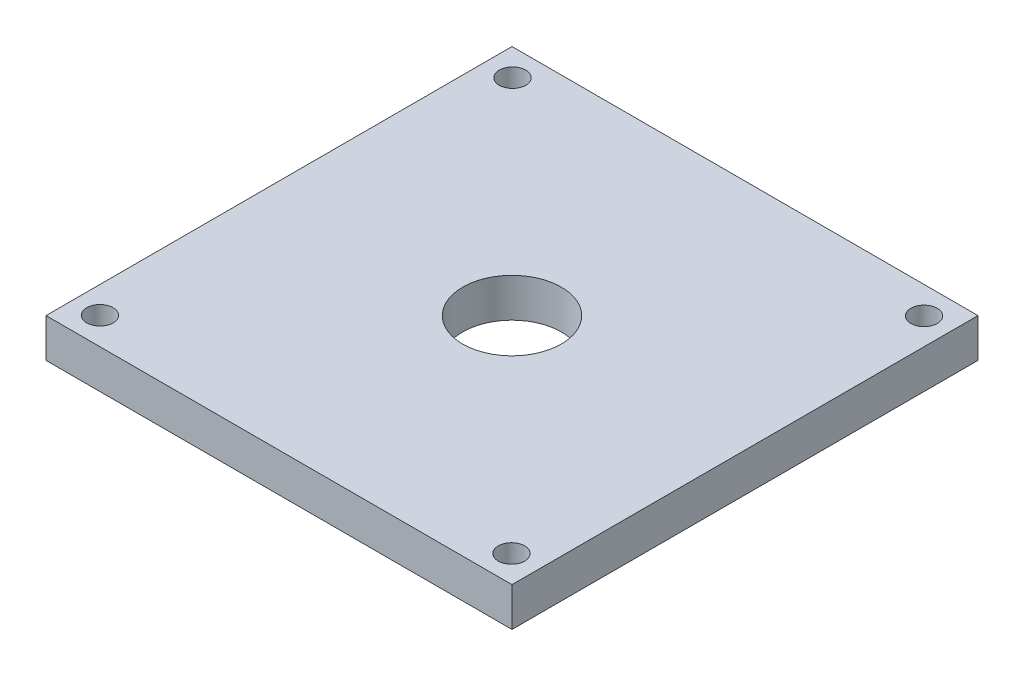
ISO-10303-21;
HEADER;
FILE_DESCRIPTION(('STEP AP214'),'2;1');
FILE_NAME('part.step','',(''),(''),'','','');
FILE_SCHEMA(('AUTOMOTIVE_DESIGN { 1 0 10303 214 1 1 1 1 }'));
ENDSEC;
DATA;
#1=APPLICATION_CONTEXT('core data for automotive mechanical design processes');
#2=APPLICATION_PROTOCOL_DEFINITION('international standard','automotive_design',2000,#1);
#3=PRODUCT_CONTEXT('',#1,'mechanical');
#4=PRODUCT('Part','Part','',(#3));
#5=PRODUCT_RELATED_PRODUCT_CATEGORY('part','',(#4));
#6=PRODUCT_DEFINITION_FORMATION('','',#4);
#7=PRODUCT_DEFINITION_CONTEXT('part definition',#1,'design');
#8=PRODUCT_DEFINITION('design','',#6,#7);
#9=PRODUCT_DEFINITION_SHAPE('','',#8);
#10=(LENGTH_UNIT() NAMED_UNIT(*) SI_UNIT(.MILLI.,.METRE.));
#11=(NAMED_UNIT(*) PLANE_ANGLE_UNIT() SI_UNIT($,.RADIAN.));
#12=(NAMED_UNIT(*) SI_UNIT($,.STERADIAN.) SOLID_ANGLE_UNIT());
#13=UNCERTAINTY_MEASURE_WITH_UNIT(LENGTH_MEASURE(1.E-05),#10,'distance_accuracy_value','');
#14=(GEOMETRIC_REPRESENTATION_CONTEXT(3) GLOBAL_UNCERTAINTY_ASSIGNED_CONTEXT((#13)) GLOBAL_UNIT_ASSIGNED_CONTEXT((#10,
#11,#12)) REPRESENTATION_CONTEXT('',''));
#15=CARTESIAN_POINT('',(0.,0.,0.));
#16=DIRECTION('',(0.,0.,1.));
#17=DIRECTION('',(1.,0.,0.));
#18=AXIS2_PLACEMENT_3D('',#15,#16,#17);
#19=CARTESIAN_POINT('',(0.,5.,0.));
#20=DIRECTION('',(0.,-1.,0.));
#21=DIRECTION('',(0.,0.,-1.));
#22=AXIS2_PLACEMENT_3D('',#19,#20,#21);
#23=PLANE('',#22);
#24=DIRECTION('',(0.,0.,1.));
#25=VECTOR('',#24,1.);
#26=CARTESIAN_POINT('',(0.,5.,0.));
#27=LINE('',#26,#25);
#28=CARTESIAN_POINT('',(0.,5.,-60.));
#29=VERTEX_POINT('',#28);
#30=CARTESIAN_POINT('',(0.,5.,0.));
#31=VERTEX_POINT('',#30);
#32=EDGE_CURVE('E95',#29,#31,#27,.T.);
#33=ORIENTED_EDGE('',*,*,#32,.T.);
#34=DIRECTION('',(1.,0.,0.));
#35=VECTOR('',#34,1.);
#36=CARTESIAN_POINT('',(0.,5.,0.));
#37=LINE('',#36,#35);
#38=CARTESIAN_POINT('',(60.,5.,0.));
#39=VERTEX_POINT('',#38);
#40=EDGE_CURVE('E90',#31,#39,#37,.T.);
#41=ORIENTED_EDGE('',*,*,#40,.T.);
#42=DIRECTION('',(0.,0.,-1.));
#43=VECTOR('',#42,1.);
#44=CARTESIAN_POINT('',(60.,5.,0.));
#45=LINE('',#44,#43);
#46=CARTESIAN_POINT('',(60.,5.,-60.));
#47=VERTEX_POINT('',#46);
#48=EDGE_CURVE('E93',#39,#47,#45,.T.);
#49=ORIENTED_EDGE('',*,*,#48,.T.);
#50=DIRECTION('',(-1.,0.,0.));
#51=VECTOR('',#50,1.);
#52=CARTESIAN_POINT('',(0.,5.,-60.));
#53=LINE('',#52,#51);
#54=EDGE_CURVE('E60',#47,#29,#53,.T.);
#55=ORIENTED_EDGE('',*,*,#54,.T.);
#56=EDGE_LOOP('',(#33,#41,#49,#55));
#57=FACE_BOUND('',#56,.T.);
#58=CARTESIAN_POINT('',(30.,5.,-30.));
#59=DIRECTION('',(0.,1.,0.));
#60=DIRECTION('',(0.,0.,1.));
#61=AXIS2_PLACEMENT_3D('',#58,#59,#60);
#62=CIRCLE('',#61,6.35);
#63=CARTESIAN_POINT('',(30.,5.,-23.65));
#64=VERTEX_POINT('',#63);
#65=EDGE_CURVE('E110',#64,#64,#62,.T.);
#66=ORIENTED_EDGE('',*,*,#65,.F.);
#67=EDGE_LOOP('',(#66));
#68=FACE_BOUND('',#67,.T.);
#69=CARTESIAN_POINT('',(3.50530286820927,5.,-56.5602431527652));
#70=DIRECTION('',(0.,1.,0.));
#71=DIRECTION('',(0.,0.,1.));
#72=AXIS2_PLACEMENT_3D('',#69,#70,#71);
#73=CIRCLE('',#72,1.7);
#74=CARTESIAN_POINT('',(3.50530286820927,5.,-54.8602431527652));
#75=VERTEX_POINT('',#74);
#76=EDGE_CURVE('E125',#75,#75,#73,.T.);
#77=ORIENTED_EDGE('',*,*,#76,.F.);
#78=EDGE_LOOP('',(#77));
#79=FACE_BOUND('',#78,.T.);
#80=CARTESIAN_POINT('',(56.5602431527653,5.,-56.4946971317914));
#81=DIRECTION('',(0.,1.,0.));
#82=DIRECTION('',(0.,0.,1.));
#83=AXIS2_PLACEMENT_3D('',#80,#81,#82);
#84=CIRCLE('',#83,1.7);
#85=CARTESIAN_POINT('',(56.5602431527653,5.,-54.7946971317914));
#86=VERTEX_POINT('',#85);
#87=EDGE_CURVE('E131',#86,#86,#84,.T.);
#88=ORIENTED_EDGE('',*,*,#87,.F.);
#89=EDGE_LOOP('',(#88));
#90=FACE_BOUND('',#89,.T.);
#91=CARTESIAN_POINT('',(56.4946971317913,5.,-3.43975684723538));
#92=DIRECTION('',(0.,1.,0.));
#93=DIRECTION('',(0.,0.,1.));
#94=AXIS2_PLACEMENT_3D('',#91,#92,#93);
#95=CIRCLE('',#94,1.7);
#96=CARTESIAN_POINT('',(56.4946971317913,5.,-1.73975684723538));
#97=VERTEX_POINT('',#96);
#98=EDGE_CURVE('E137',#97,#97,#95,.T.);
#99=ORIENTED_EDGE('',*,*,#98,.F.);
#100=EDGE_LOOP('',(#99));
#101=FACE_BOUND('',#100,.T.);
#102=CARTESIAN_POINT('',(3.43975684723528,5.,-3.50530286820955));
#103=DIRECTION('',(0.,1.,0.));
#104=DIRECTION('',(0.,0.,1.));
#105=AXIS2_PLACEMENT_3D('',#102,#103,#104);
#106=CIRCLE('',#105,1.7);
#107=CARTESIAN_POINT('',(3.43975684723528,5.,-1.80530286820955));
#108=VERTEX_POINT('',#107);
#109=EDGE_CURVE('E143',#108,#108,#106,.T.);
#110=ORIENTED_EDGE('',*,*,#109,.F.);
#111=EDGE_LOOP('',(#110));
#112=FACE_BOUND('',#111,.T.);
#113=ADVANCED_FACE('F43',(#57,#68,#79,#90,#101,#112),#23,.F.);
#114=CARTESIAN_POINT('',(0.,0.,0.));
#115=DIRECTION('',(0.,-1.,0.));
#116=DIRECTION('',(0.,0.,-1.));
#117=AXIS2_PLACEMENT_3D('',#114,#115,#116);
#118=PLANE('',#117);
#119=CARTESIAN_POINT('',(56.4946971317913,0.,-3.43975684723538));
#120=DIRECTION('',(0.,1.,0.));
#121=DIRECTION('',(0.,0.,1.));
#122=AXIS2_PLACEMENT_3D('',#119,#120,#121);
#123=CIRCLE('',#122,1.7);
#124=CARTESIAN_POINT('',(56.4946971317913,0.,-1.73975684723538));
#125=VERTEX_POINT('',#124);
#126=EDGE_CURVE('E140',#125,#125,#123,.T.);
#127=ORIENTED_EDGE('',*,*,#126,.T.);
#128=EDGE_LOOP('',(#127));
#129=FACE_BOUND('',#128,.T.);
#130=CARTESIAN_POINT('',(3.50530286820927,0.,-56.5602431527652));
#131=DIRECTION('',(0.,1.,0.));
#132=DIRECTION('',(0.,0.,1.));
#133=AXIS2_PLACEMENT_3D('',#130,#131,#132);
#134=CIRCLE('',#133,1.7);
#135=CARTESIAN_POINT('',(3.50530286820927,0.,-54.8602431527652));
#136=VERTEX_POINT('',#135);
#137=EDGE_CURVE('E128',#136,#136,#134,.T.);
#138=ORIENTED_EDGE('',*,*,#137,.T.);
#139=EDGE_LOOP('',(#138));
#140=FACE_BOUND('',#139,.T.);
#141=DIRECTION('',(0.,0.,1.));
#142=VECTOR('',#141,1.);
#143=CARTESIAN_POINT('',(0.,0.,0.));
#144=LINE('',#143,#142);
#145=CARTESIAN_POINT('',(0.,0.,-60.));
#146=VERTEX_POINT('',#145);
#147=CARTESIAN_POINT('',(0.,0.,0.));
#148=VERTEX_POINT('',#147);
#149=EDGE_CURVE('E107',#146,#148,#144,.T.);
#150=ORIENTED_EDGE('',*,*,#149,.F.);
#151=DIRECTION('',(-1.,0.,0.));
#152=VECTOR('',#151,1.);
#153=CARTESIAN_POINT('',(0.,0.,-60.));
#154=LINE('',#153,#152);
#155=CARTESIAN_POINT('',(60.,0.,-60.));
#156=VERTEX_POINT('',#155);
#157=EDGE_CURVE('E83',#156,#146,#154,.T.);
#158=ORIENTED_EDGE('',*,*,#157,.F.);
#159=DIRECTION('',(0.,0.,-1.));
#160=VECTOR('',#159,1.);
#161=CARTESIAN_POINT('',(60.,0.,0.));
#162=LINE('',#161,#160);
#163=CARTESIAN_POINT('',(60.,0.,0.));
#164=VERTEX_POINT('',#163);
#165=EDGE_CURVE('E77',#164,#156,#162,.T.);
#166=ORIENTED_EDGE('',*,*,#165,.F.);
#167=DIRECTION('',(1.,0.,0.));
#168=VECTOR('',#167,1.);
#169=CARTESIAN_POINT('',(0.,0.,0.));
#170=LINE('',#169,#168);
#171=EDGE_CURVE('E99',#148,#164,#170,.T.);
#172=ORIENTED_EDGE('',*,*,#171,.F.);
#173=EDGE_LOOP('',(#150,#158,#166,#172));
#174=FACE_BOUND('',#173,.T.);
#175=CARTESIAN_POINT('',(30.,0.,-30.));
#176=DIRECTION('',(0.,1.,0.));
#177=DIRECTION('',(0.,0.,1.));
#178=AXIS2_PLACEMENT_3D('',#175,#176,#177);
#179=CIRCLE('',#178,6.35);
#180=CARTESIAN_POINT('',(30.,0.,-23.65));
#181=VERTEX_POINT('',#180);
#182=EDGE_CURVE('E122',#181,#181,#179,.T.);
#183=ORIENTED_EDGE('',*,*,#182,.T.);
#184=EDGE_LOOP('',(#183));
#185=FACE_BOUND('',#184,.T.);
#186=CARTESIAN_POINT('',(56.5602431527653,0.,-56.4946971317914));
#187=DIRECTION('',(0.,1.,0.));
#188=DIRECTION('',(0.,0.,1.));
#189=AXIS2_PLACEMENT_3D('',#186,#187,#188);
#190=CIRCLE('',#189,1.7);
#191=CARTESIAN_POINT('',(56.5602431527653,0.,-54.7946971317914));
#192=VERTEX_POINT('',#191);
#193=EDGE_CURVE('E134',#192,#192,#190,.T.);
#194=ORIENTED_EDGE('',*,*,#193,.T.);
#195=EDGE_LOOP('',(#194));
#196=FACE_BOUND('',#195,.T.);
#197=CARTESIAN_POINT('',(3.43975684723528,0.,-3.50530286820955));
#198=DIRECTION('',(0.,1.,0.));
#199=DIRECTION('',(0.,0.,1.));
#200=AXIS2_PLACEMENT_3D('',#197,#198,#199);
#201=CIRCLE('',#200,1.7);
#202=CARTESIAN_POINT('',(3.43975684723528,0.,-1.80530286820955));
#203=VERTEX_POINT('',#202);
#204=EDGE_CURVE('E146',#203,#203,#201,.T.);
#205=ORIENTED_EDGE('',*,*,#204,.T.);
#206=EDGE_LOOP('',(#205));
#207=FACE_BOUND('',#206,.T.);
#208=ADVANCED_FACE('F118',(#129,#140,#174,#185,#196,#207),#118,.T.);
#209=CARTESIAN_POINT('',(0.,5.,0.));
#210=DIRECTION('',(1.,0.,0.));
#211=DIRECTION('',(0.,0.,-1.));
#212=AXIS2_PLACEMENT_3D('',#209,#210,#211);
#213=PLANE('',#212);
#214=ORIENTED_EDGE('',*,*,#149,.T.);
#215=DIRECTION('',(0.,-1.,0.));
#216=VECTOR('',#215,1.);
#217=CARTESIAN_POINT('',(0.,5.,0.));
#218=LINE('',#217,#216);
#219=EDGE_CURVE('E11',#31,#148,#218,.T.);
#220=ORIENTED_EDGE('',*,*,#219,.F.);
#221=ORIENTED_EDGE('',*,*,#32,.F.);
#222=DIRECTION('',(0.,-1.,0.));
#223=VECTOR('',#222,1.);
#224=CARTESIAN_POINT('',(0.,5.,-60.));
#225=LINE('',#224,#223);
#226=EDGE_CURVE('E103',#29,#146,#225,.T.);
#227=ORIENTED_EDGE('',*,*,#226,.T.);
#228=EDGE_LOOP('',(#214,#220,#221,#227));
#229=FACE_BOUND('',#228,.T.);
#230=ADVANCED_FACE('F45',(#229),#213,.F.);
#231=CARTESIAN_POINT('',(0.,5.,0.));
#232=DIRECTION('',(0.,0.,-1.));
#233=DIRECTION('',(-1.,0.,0.));
#234=AXIS2_PLACEMENT_3D('',#231,#232,#233);
#235=PLANE('',#234);
#236=ORIENTED_EDGE('',*,*,#171,.T.);
#237=DIRECTION('',(0.,-1.,0.));
#238=VECTOR('',#237,1.);
#239=CARTESIAN_POINT('',(60.,5.,0.));
#240=LINE('',#239,#238);
#241=EDGE_CURVE('E52',#39,#164,#240,.T.);
#242=ORIENTED_EDGE('',*,*,#241,.F.);
#243=ORIENTED_EDGE('',*,*,#40,.F.);
#244=ORIENTED_EDGE('',*,*,#219,.T.);
#245=EDGE_LOOP('',(#236,#242,#243,#244));
#246=FACE_BOUND('',#245,.T.);
#247=ADVANCED_FACE('F98',(#246),#235,.F.);
#248=CARTESIAN_POINT('',(60.,5.,0.));
#249=DIRECTION('',(-1.,0.,0.));
#250=DIRECTION('',(0.,0.,1.));
#251=AXIS2_PLACEMENT_3D('',#248,#249,#250);
#252=PLANE('',#251);
#253=ORIENTED_EDGE('',*,*,#165,.T.);
#254=DIRECTION('',(0.,-1.,0.));
#255=VECTOR('',#254,1.);
#256=CARTESIAN_POINT('',(60.,5.,-60.));
#257=LINE('',#256,#255);
#258=EDGE_CURVE('E100',#47,#156,#257,.T.);
#259=ORIENTED_EDGE('',*,*,#258,.F.);
#260=ORIENTED_EDGE('',*,*,#48,.F.);
#261=ORIENTED_EDGE('',*,*,#241,.T.);
#262=EDGE_LOOP('',(#253,#259,#260,#261));
#263=FACE_BOUND('',#262,.T.);
#264=ADVANCED_FACE('F101',(#263),#252,.F.);
#265=CARTESIAN_POINT('',(0.,5.,-60.));
#266=DIRECTION('',(0.,0.,1.));
#267=DIRECTION('',(1.,0.,0.));
#268=AXIS2_PLACEMENT_3D('',#265,#266,#267);
#269=PLANE('',#268);
#270=ORIENTED_EDGE('',*,*,#157,.T.);
#271=ORIENTED_EDGE('',*,*,#226,.F.);
#272=ORIENTED_EDGE('',*,*,#54,.F.);
#273=ORIENTED_EDGE('',*,*,#258,.T.);
#274=EDGE_LOOP('',(#270,#271,#272,#273));
#275=FACE_BOUND('',#274,.T.);
#276=ADVANCED_FACE('F115',(#275),#269,.F.);
#277=CARTESIAN_POINT('',(30.,5.,-30.));
#278=DIRECTION('',(0.,-1.,0.));
#279=DIRECTION('',(0.,0.,-1.));
#280=AXIS2_PLACEMENT_3D('',#277,#278,#279);
#281=CYLINDRICAL_SURFACE('',#280,6.35);
#282=ORIENTED_EDGE('',*,*,#65,.T.);
#283=EDGE_LOOP('',(#282));
#284=FACE_BOUND('',#283,.T.);
#285=ORIENTED_EDGE('',*,*,#182,.F.);
#286=EDGE_LOOP('',(#285));
#287=FACE_BOUND('',#286,.T.);
#288=ADVANCED_FACE('F162',(#284,#287),#281,.F.);
#289=CARTESIAN_POINT('',(3.50530286820927,5.,-56.5602431527652));
#290=DIRECTION('',(0.,-1.,0.));
#291=DIRECTION('',(0.,0.,-1.));
#292=AXIS2_PLACEMENT_3D('',#289,#290,#291);
#293=CYLINDRICAL_SURFACE('',#292,1.7);
#294=ORIENTED_EDGE('',*,*,#76,.T.);
#295=EDGE_LOOP('',(#294));
#296=FACE_BOUND('',#295,.T.);
#297=ORIENTED_EDGE('',*,*,#137,.F.);
#298=EDGE_LOOP('',(#297));
#299=FACE_BOUND('',#298,.T.);
#300=ADVANCED_FACE('F213',(#296,#299),#293,.F.);
#301=CARTESIAN_POINT('',(56.5602431527653,5.,-56.4946971317914));
#302=DIRECTION('',(0.,-1.,0.));
#303=DIRECTION('',(0.,0.,-1.));
#304=AXIS2_PLACEMENT_3D('',#301,#302,#303);
#305=CYLINDRICAL_SURFACE('',#304,1.7);
#306=ORIENTED_EDGE('',*,*,#87,.T.);
#307=EDGE_LOOP('',(#306));
#308=FACE_BOUND('',#307,.T.);
#309=ORIENTED_EDGE('',*,*,#193,.F.);
#310=EDGE_LOOP('',(#309));
#311=FACE_BOUND('',#310,.T.);
#312=ADVANCED_FACE('F222',(#308,#311),#305,.F.);
#313=CARTESIAN_POINT('',(56.4946971317913,5.,-3.43975684723538));
#314=DIRECTION('',(0.,-1.,0.));
#315=DIRECTION('',(0.,0.,-1.));
#316=AXIS2_PLACEMENT_3D('',#313,#314,#315);
#317=CYLINDRICAL_SURFACE('',#316,1.7);
#318=ORIENTED_EDGE('',*,*,#98,.T.);
#319=EDGE_LOOP('',(#318));
#320=FACE_BOUND('',#319,.T.);
#321=ORIENTED_EDGE('',*,*,#126,.F.);
#322=EDGE_LOOP('',(#321));
#323=FACE_BOUND('',#322,.T.);
#324=ADVANCED_FACE('F231',(#320,#323),#317,.F.);
#325=CARTESIAN_POINT('',(3.43975684723528,5.,-3.50530286820955));
#326=DIRECTION('',(0.,-1.,0.));
#327=DIRECTION('',(0.,0.,-1.));
#328=AXIS2_PLACEMENT_3D('',#325,#326,#327);
#329=CYLINDRICAL_SURFACE('',#328,1.7);
#330=ORIENTED_EDGE('',*,*,#109,.T.);
#331=EDGE_LOOP('',(#330));
#332=FACE_BOUND('',#331,.T.);
#333=ORIENTED_EDGE('',*,*,#204,.F.);
#334=EDGE_LOOP('',(#333));
#335=FACE_BOUND('',#334,.T.);
#336=ADVANCED_FACE('F152',(#332,#335),#329,.F.);
#337=CLOSED_SHELL('',(#113,#208,#230,#247,#264,#276,#288,#300,#312,#324,#336));
#338=MANIFOLD_SOLID_BREP('B2',#337);
#339=ADVANCED_BREP_SHAPE_REPRESENTATION('',(#18,#338),#14);
#340=SHAPE_DEFINITION_REPRESENTATION(#9,#339);
ENDSEC;
END-ISO-10303-21;
